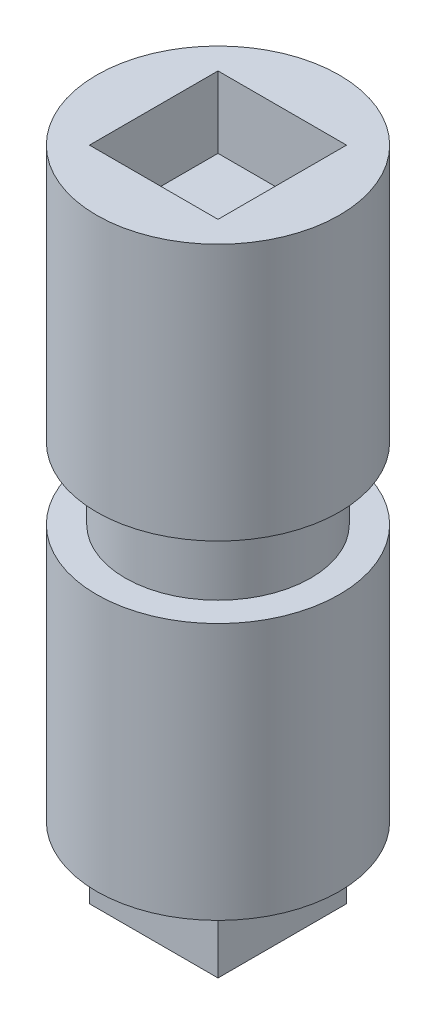
ISO-10303-21;
HEADER;
FILE_DESCRIPTION(('STEP AP214'),'2;1');
FILE_NAME('part.step','',(''),(''),'','','');
FILE_SCHEMA(('AUTOMOTIVE_DESIGN { 1 0 10303 214 1 1 1 1 }'));
ENDSEC;
DATA;
#1=APPLICATION_CONTEXT('core data for automotive mechanical design processes');
#2=APPLICATION_PROTOCOL_DEFINITION('international standard','automotive_design',2000,#1);
#3=PRODUCT_CONTEXT('',#1,'mechanical');
#4=PRODUCT('Part','Part','',(#3));
#5=PRODUCT_RELATED_PRODUCT_CATEGORY('part','',(#4));
#6=PRODUCT_DEFINITION_FORMATION('','',#4);
#7=PRODUCT_DEFINITION_CONTEXT('part definition',#1,'design');
#8=PRODUCT_DEFINITION('design','',#6,#7);
#9=PRODUCT_DEFINITION_SHAPE('','',#8);
#10=(LENGTH_UNIT() NAMED_UNIT(*) SI_UNIT(.MILLI.,.METRE.));
#11=(NAMED_UNIT(*) PLANE_ANGLE_UNIT() SI_UNIT($,.RADIAN.));
#12=(NAMED_UNIT(*) SI_UNIT($,.STERADIAN.) SOLID_ANGLE_UNIT());
#13=UNCERTAINTY_MEASURE_WITH_UNIT(LENGTH_MEASURE(1.E-05),#10,'distance_accuracy_value','');
#14=(GEOMETRIC_REPRESENTATION_CONTEXT(3) GLOBAL_UNCERTAINTY_ASSIGNED_CONTEXT((#13)) GLOBAL_UNIT_ASSIGNED_CONTEXT((#10,
#11,#12)) REPRESENTATION_CONTEXT('',''));
#15=CARTESIAN_POINT('',(0.,0.,0.));
#16=DIRECTION('',(0.,0.,1.));
#17=DIRECTION('',(1.,0.,0.));
#18=AXIS2_PLACEMENT_3D('',#15,#16,#17);
#19=CARTESIAN_POINT('',(0.,0.,0.));
#20=DIRECTION('',(0.,1.,0.));
#21=DIRECTION('',(0.,0.,1.));
#22=AXIS2_PLACEMENT_3D('',#19,#20,#21);
#23=PLANE('',#22);
#24=CARTESIAN_POINT('',(0.,0.,0.));
#25=DIRECTION('',(0.,1.,0.));
#26=DIRECTION('',(0.,0.,1.));
#27=AXIS2_PLACEMENT_3D('',#24,#25,#26);
#28=CIRCLE('',#27,85.);
#29=CARTESIAN_POINT('',(0.,0.,-85.));
#30=VERTEX_POINT('',#29);
#31=EDGE_CURVE('E37',#30,#30,#28,.T.);
#32=ORIENTED_EDGE('',*,*,#31,.F.);
#33=EDGE_LOOP('',(#32));
#34=FACE_BOUND('',#33,.T.);
#35=DIRECTION('',(0.,0.,-1.));
#36=VECTOR('',#35,1.);
#37=CARTESIAN_POINT('',(-45.,0.,45.));
#38=LINE('',#37,#36);
#39=CARTESIAN_POINT('',(-45.,0.,45.));
#40=VERTEX_POINT('',#39);
#41=CARTESIAN_POINT('',(-45.,0.,-45.));
#42=VERTEX_POINT('',#41);
#43=EDGE_CURVE('E58',#40,#42,#38,.T.);
#44=ORIENTED_EDGE('',*,*,#43,.F.);
#45=DIRECTION('',(-1.,0.,0.));
#46=VECTOR('',#45,1.);
#47=CARTESIAN_POINT('',(45.,0.,45.));
#48=LINE('',#47,#46);
#49=CARTESIAN_POINT('',(45.,0.,45.));
#50=VERTEX_POINT('',#49);
#51=EDGE_CURVE('E151',#50,#40,#48,.T.);
#52=ORIENTED_EDGE('',*,*,#51,.F.);
#53=DIRECTION('',(0.,0.,1.));
#54=VECTOR('',#53,1.);
#55=CARTESIAN_POINT('',(45.,0.,45.));
#56=LINE('',#55,#54);
#57=CARTESIAN_POINT('',(45.,0.,-45.));
#58=VERTEX_POINT('',#57);
#59=EDGE_CURVE('E162',#58,#50,#56,.T.);
#60=ORIENTED_EDGE('',*,*,#59,.F.);
#61=DIRECTION('',(1.,0.,0.));
#62=VECTOR('',#61,1.);
#63=CARTESIAN_POINT('',(45.,0.,-45.));
#64=LINE('',#63,#62);
#65=EDGE_CURVE('E159',#42,#58,#64,.T.);
#66=ORIENTED_EDGE('',*,*,#65,.F.);
#67=EDGE_LOOP('',(#44,#52,#60,#66));
#68=FACE_BOUND('',#67,.T.);
#69=ADVANCED_FACE('F33',(#34,#68),#23,.F.);
#70=CARTESIAN_POINT('',(0.,180.,0.));
#71=DIRECTION('',(0.,-1.,0.));
#72=DIRECTION('',(0.,0.,-1.));
#73=AXIS2_PLACEMENT_3D('',#70,#71,#72);
#74=CYLINDRICAL_SURFACE('',#73,85.);
#75=CARTESIAN_POINT('',(0.,180.,0.));
#76=DIRECTION('',(0.,1.,0.));
#77=DIRECTION('',(0.,0.,1.));
#78=AXIS2_PLACEMENT_3D('',#75,#76,#77);
#79=CIRCLE('',#78,85.);
#80=CARTESIAN_POINT('',(0.,180.,-85.));
#81=VERTEX_POINT('',#80);
#82=EDGE_CURVE('E42',#81,#81,#79,.T.);
#83=CARTESIAN_POINT('',(0.,180.,-85.));
#84=CARTESIAN_POINT('',(0.,178.125,-85.));
#85=CARTESIAN_POINT('',(0.,176.25,-85.));
#86=CARTESIAN_POINT('',(0.,172.5,-85.));
#87=CARTESIAN_POINT('',(0.,170.625,-85.));
#88=CARTESIAN_POINT('',(0.,166.875,-85.));
#89=CARTESIAN_POINT('',(0.,165.,-85.));
#90=CARTESIAN_POINT('',(0.,161.25,-85.));
#91=CARTESIAN_POINT('',(0.,159.375,-85.));
#92=CARTESIAN_POINT('',(0.,155.625,-85.));
#93=CARTESIAN_POINT('',(0.,153.75,-85.));
#94=CARTESIAN_POINT('',(0.,150.,-85.));
#95=CARTESIAN_POINT('',(0.,148.125,-85.));
#96=CARTESIAN_POINT('',(0.,144.375,-85.));
#97=CARTESIAN_POINT('',(0.,142.5,-85.));
#98=CARTESIAN_POINT('',(0.,138.75,-85.));
#99=CARTESIAN_POINT('',(0.,136.875,-85.));
#100=CARTESIAN_POINT('',(0.,133.125,-85.));
#101=CARTESIAN_POINT('',(0.,131.25,-85.));
#102=CARTESIAN_POINT('',(0.,127.5,-85.));
#103=CARTESIAN_POINT('',(0.,125.625,-85.));
#104=CARTESIAN_POINT('',(0.,121.875,-85.));
#105=CARTESIAN_POINT('',(0.,120.,-85.));
#106=CARTESIAN_POINT('',(0.,116.25,-85.));
#107=CARTESIAN_POINT('',(0.,114.375,-85.));
#108=CARTESIAN_POINT('',(0.,110.625,-85.));
#109=CARTESIAN_POINT('',(0.,108.75,-85.));
#110=CARTESIAN_POINT('',(0.,105.,-85.));
#111=CARTESIAN_POINT('',(0.,103.125,-85.));
#112=CARTESIAN_POINT('',(0.,99.375,-85.));
#113=CARTESIAN_POINT('',(0.,97.5,-85.));
#114=CARTESIAN_POINT('',(0.,93.75,-85.));
#115=CARTESIAN_POINT('',(0.,91.875,-85.));
#116=CARTESIAN_POINT('',(0.,88.125,-85.));
#117=CARTESIAN_POINT('',(0.,86.25,-85.));
#118=CARTESIAN_POINT('',(0.,82.5,-85.));
#119=CARTESIAN_POINT('',(0.,80.625,-85.));
#120=CARTESIAN_POINT('',(0.,76.875,-85.));
#121=CARTESIAN_POINT('',(0.,75.,-85.));
#122=CARTESIAN_POINT('',(0.,71.25,-85.));
#123=CARTESIAN_POINT('',(0.,69.375,-85.));
#124=CARTESIAN_POINT('',(0.,65.625,-85.));
#125=CARTESIAN_POINT('',(0.,63.75,-85.));
#126=CARTESIAN_POINT('',(0.,60.,-85.));
#127=CARTESIAN_POINT('',(0.,58.125,-85.));
#128=CARTESIAN_POINT('',(0.,54.375,-85.));
#129=CARTESIAN_POINT('',(0.,52.5,-85.));
#130=CARTESIAN_POINT('',(0.,48.75,-85.));
#131=CARTESIAN_POINT('',(0.,46.875,-85.));
#132=CARTESIAN_POINT('',(0.,43.125,-85.));
#133=CARTESIAN_POINT('',(0.,41.25,-85.));
#134=CARTESIAN_POINT('',(0.,37.5,-85.));
#135=CARTESIAN_POINT('',(0.,35.625,-85.));
#136=CARTESIAN_POINT('',(0.,31.875,-85.));
#137=CARTESIAN_POINT('',(0.,30.,-85.));
#138=CARTESIAN_POINT('',(0.,26.25,-85.));
#139=CARTESIAN_POINT('',(0.,24.375,-85.));
#140=CARTESIAN_POINT('',(0.,20.625,-85.));
#141=CARTESIAN_POINT('',(0.,18.75,-85.));
#142=CARTESIAN_POINT('',(0.,15.,-85.));
#143=CARTESIAN_POINT('',(0.,13.125,-85.));
#144=CARTESIAN_POINT('',(0.,9.37499999999998,-85.));
#145=CARTESIAN_POINT('',(0.,7.49999999999997,-85.));
#146=CARTESIAN_POINT('',(0.,3.74999999999997,-85.));
#147=CARTESIAN_POINT('',(0.,1.87499999999997,-85.));
#148=CARTESIAN_POINT('',(0.,0.,-85.));
#149=B_SPLINE_CURVE_WITH_KNOTS('',3,(#83,#84,#85,#86,#87,#88,#89,#90,#91,#92,#93,#94,#95,#96,
#97,#98,#99,#100,#101,#102,#103,#104,#105,#106,#107,#108,#109,#110,#111,#112,#113,#114,#115,
#116,#117,#118,#119,#120,#121,#122,#123,#124,#125,#126,#127,#128,#129,#130,#131,#132,#133,#134,
#135,#136,#137,#138,#139,#140,#141,#142,#143,#144,#145,#146,#147,#148),.UNSPECIFIED.,.F.,.F.,(4,
2,2,2,2,2,2,2,2,2,2,2,2,2,2,2,2,2,2,2,2,2,2,2,2,2,2,2,2,2,2,2,4),(0.,5.62499999999999,11.25,
16.875,22.5,28.125,33.75,39.375,45.,50.625,56.25,61.875,67.5,73.125,78.75,84.375,90.,95.625,
101.25,106.875,112.5,118.125,123.75,129.375,135.,140.625,146.25,151.875,157.5,163.125,168.75,
174.375,180.),.UNSPECIFIED.);
#150=EDGE_CURVE('BSEAM35',#81,#30,#149,.T.);
#151=ORIENTED_EDGE('',*,*,#82,.F.);
#152=ORIENTED_EDGE('',*,*,#31,.T.);
#153=ORIENTED_EDGE('',*,*,#150,.T.);
#154=ORIENTED_EDGE('',*,*,#150,.F.);
#155=EDGE_LOOP('',(#151,#153,#152,#154));
#156=FACE_BOUND('',#155,.T.);
#157=ADVANCED_FACE('F35',(#156),#74,.T.);
#158=CARTESIAN_POINT('',(0.,180.,0.));
#159=DIRECTION('',(0.,1.,0.));
#160=DIRECTION('',(0.,0.,1.));
#161=AXIS2_PLACEMENT_3D('',#158,#159,#160);
#162=PLANE('',#161);
#163=CARTESIAN_POINT('',(0.,180.,0.));
#164=DIRECTION('',(0.,1.,0.));
#165=DIRECTION('',(0.,0.,1.));
#166=AXIS2_PLACEMENT_3D('',#163,#164,#165);
#167=CIRCLE('',#166,65.);
#168=CARTESIAN_POINT('',(0.,180.,65.));
#169=VERTEX_POINT('',#168);
#170=EDGE_CURVE('E11',#169,#169,#167,.T.);
#171=ORIENTED_EDGE('',*,*,#170,.F.);
#172=EDGE_LOOP('',(#171));
#173=FACE_BOUND('',#172,.T.);
#174=ORIENTED_EDGE('',*,*,#82,.T.);
#175=EDGE_LOOP('',(#174));
#176=FACE_BOUND('',#175,.T.);
#177=ADVANCED_FACE('F187',(#173,#176),#162,.T.);
#178=CARTESIAN_POINT('',(-45.,-50.,45.));
#179=DIRECTION('',(1.,0.,0.));
#180=DIRECTION('',(0.,0.,-1.));
#181=AXIS2_PLACEMENT_3D('',#178,#179,#180);
#182=PLANE('',#181);
#183=ORIENTED_EDGE('',*,*,#43,.T.);
#184=DIRECTION('',(0.,1.,0.));
#185=VECTOR('',#184,1.);
#186=CARTESIAN_POINT('',(-45.,-50.,-45.));
#187=LINE('',#186,#185);
#188=CARTESIAN_POINT('',(-45.,-50.,-45.));
#189=VERTEX_POINT('',#188);
#190=EDGE_CURVE('E174',#189,#42,#187,.T.);
#191=ORIENTED_EDGE('',*,*,#190,.F.);
#192=DIRECTION('',(0.,0.,-1.));
#193=VECTOR('',#192,1.);
#194=CARTESIAN_POINT('',(-45.,-50.,45.));
#195=LINE('',#194,#193);
#196=CARTESIAN_POINT('',(-45.,-50.,45.));
#197=VERTEX_POINT('',#196);
#198=EDGE_CURVE('E147',#197,#189,#195,.T.);
#199=ORIENTED_EDGE('',*,*,#198,.F.);
#200=DIRECTION('',(0.,1.,0.));
#201=VECTOR('',#200,1.);
#202=CARTESIAN_POINT('',(-45.,-50.,45.));
#203=LINE('',#202,#201);
#204=EDGE_CURVE('E157',#197,#40,#203,.T.);
#205=ORIENTED_EDGE('',*,*,#204,.T.);
#206=EDGE_LOOP('',(#183,#191,#199,#205));
#207=FACE_BOUND('',#206,.T.);
#208=ADVANCED_FACE('F192',(#207),#182,.F.);
#209=CARTESIAN_POINT('',(45.,-50.,-45.));
#210=DIRECTION('',(0.,0.,1.));
#211=DIRECTION('',(1.,0.,0.));
#212=AXIS2_PLACEMENT_3D('',#209,#210,#211);
#213=PLANE('',#212);
#214=ORIENTED_EDGE('',*,*,#65,.T.);
#215=DIRECTION('',(0.,1.,0.));
#216=VECTOR('',#215,1.);
#217=CARTESIAN_POINT('',(45.,-50.,-45.));
#218=LINE('',#217,#216);
#219=CARTESIAN_POINT('',(45.,-50.,-45.));
#220=VERTEX_POINT('',#219);
#221=EDGE_CURVE('E171',#220,#58,#218,.T.);
#222=ORIENTED_EDGE('',*,*,#221,.F.);
#223=DIRECTION('',(1.,0.,0.));
#224=VECTOR('',#223,1.);
#225=CARTESIAN_POINT('',(45.,-50.,-45.));
#226=LINE('',#225,#224);
#227=EDGE_CURVE('E150',#189,#220,#226,.T.);
#228=ORIENTED_EDGE('',*,*,#227,.F.);
#229=ORIENTED_EDGE('',*,*,#190,.T.);
#230=EDGE_LOOP('',(#214,#222,#228,#229));
#231=FACE_BOUND('',#230,.T.);
#232=ADVANCED_FACE('F196',(#231),#213,.F.);
#233=CARTESIAN_POINT('',(45.,-50.,45.));
#234=DIRECTION('',(-1.,0.,0.));
#235=DIRECTION('',(0.,0.,1.));
#236=AXIS2_PLACEMENT_3D('',#233,#234,#235);
#237=PLANE('',#236);
#238=ORIENTED_EDGE('',*,*,#59,.T.);
#239=DIRECTION('',(0.,1.,0.));
#240=VECTOR('',#239,1.);
#241=CARTESIAN_POINT('',(45.,-50.,45.));
#242=LINE('',#241,#240);
#243=CARTESIAN_POINT('',(45.,-50.,45.));
#244=VERTEX_POINT('',#243);
#245=EDGE_CURVE('E168',#244,#50,#242,.T.);
#246=ORIENTED_EDGE('',*,*,#245,.F.);
#247=DIRECTION('',(0.,0.,1.));
#248=VECTOR('',#247,1.);
#249=CARTESIAN_POINT('',(45.,-50.,45.));
#250=LINE('',#249,#248);
#251=EDGE_CURVE('E153',#220,#244,#250,.T.);
#252=ORIENTED_EDGE('',*,*,#251,.F.);
#253=ORIENTED_EDGE('',*,*,#221,.T.);
#254=EDGE_LOOP('',(#238,#246,#252,#253));
#255=FACE_BOUND('',#254,.T.);
#256=ADVANCED_FACE('F200',(#255),#237,.F.);
#257=CARTESIAN_POINT('',(45.,-50.,45.));
#258=DIRECTION('',(0.,0.,-1.));
#259=DIRECTION('',(-1.,0.,0.));
#260=AXIS2_PLACEMENT_3D('',#257,#258,#259);
#261=PLANE('',#260);
#262=ORIENTED_EDGE('',*,*,#51,.T.);
#263=ORIENTED_EDGE('',*,*,#204,.F.);
#264=DIRECTION('',(-1.,0.,0.));
#265=VECTOR('',#264,1.);
#266=CARTESIAN_POINT('',(45.,-50.,45.));
#267=LINE('',#266,#265);
#268=EDGE_CURVE('E155',#244,#197,#267,.T.);
#269=ORIENTED_EDGE('',*,*,#268,.F.);
#270=ORIENTED_EDGE('',*,*,#245,.T.);
#271=EDGE_LOOP('',(#262,#263,#269,#270));
#272=FACE_BOUND('',#271,.T.);
#273=ADVANCED_FACE('F204',(#272),#261,.F.);
#274=CARTESIAN_POINT('',(0.,-50.,0.));
#275=DIRECTION('',(0.,1.,0.));
#276=DIRECTION('',(0.,0.,1.));
#277=AXIS2_PLACEMENT_3D('',#274,#275,#276);
#278=PLANE('',#277);
#279=ORIENTED_EDGE('',*,*,#198,.T.);
#280=ORIENTED_EDGE('',*,*,#227,.T.);
#281=ORIENTED_EDGE('',*,*,#251,.T.);
#282=ORIENTED_EDGE('',*,*,#268,.T.);
#283=EDGE_LOOP('',(#279,#280,#281,#282));
#284=FACE_BOUND('',#283,.T.);
#285=ADVANCED_FACE('F208',(#284),#278,.F.);
#286=CARTESIAN_POINT('',(0.,230.,0.));
#287=DIRECTION('',(0.,-1.,0.));
#288=DIRECTION('',(0.,0.,-1.));
#289=AXIS2_PLACEMENT_3D('',#286,#287,#288);
#290=CYLINDRICAL_SURFACE('',#289,65.);
#291=CARTESIAN_POINT('',(0.,230.,0.));
#292=DIRECTION('',(0.,1.,0.));
#293=DIRECTION('',(0.,0.,1.));
#294=AXIS2_PLACEMENT_3D('',#291,#292,#293);
#295=CIRCLE('',#294,65.);
#296=CARTESIAN_POINT('',(0.,230.,65.));
#297=VERTEX_POINT('',#296);
#298=EDGE_CURVE('E142',#297,#297,#295,.T.);
#299=ORIENTED_EDGE('',*,*,#298,.F.);
#300=EDGE_LOOP('',(#299));
#301=FACE_BOUND('',#300,.T.);
#302=ORIENTED_EDGE('',*,*,#170,.T.);
#303=EDGE_LOOP('',(#302));
#304=FACE_BOUND('',#303,.T.);
#305=ADVANCED_FACE('F212',(#301,#304),#290,.T.);
#306=CARTESIAN_POINT('',(0.,410.,0.));
#307=DIRECTION('',(0.,-1.,0.));
#308=DIRECTION('',(0.,0.,-1.));
#309=AXIS2_PLACEMENT_3D('',#306,#307,#308);
#310=CYLINDRICAL_SURFACE('',#309,85.);
#311=CARTESIAN_POINT('',(0.,410.,0.));
#312=DIRECTION('',(0.,1.,0.));
#313=DIRECTION('',(0.,0.,1.));
#314=AXIS2_PLACEMENT_3D('',#311,#312,#313);
#315=CIRCLE('',#314,85.);
#316=CARTESIAN_POINT('',(0.,410.,-85.));
#317=VERTEX_POINT('',#316);
#318=EDGE_CURVE('E139',#317,#317,#315,.T.);
#319=CARTESIAN_POINT('',(0.,230.,0.));
#320=DIRECTION('',(0.,1.,0.));
#321=DIRECTION('',(0.,0.,1.));
#322=AXIS2_PLACEMENT_3D('',#319,#320,#321);
#323=CIRCLE('',#322,85.);
#324=CARTESIAN_POINT('',(0.,230.,-85.));
#325=VERTEX_POINT('',#324);
#326=EDGE_CURVE('E135',#325,#325,#323,.T.);
#327=CARTESIAN_POINT('',(0.,410.,-85.));
#328=CARTESIAN_POINT('',(0.,408.125,-85.));
#329=CARTESIAN_POINT('',(0.,406.25,-85.));
#330=CARTESIAN_POINT('',(0.,402.5,-85.));
#331=CARTESIAN_POINT('',(0.,400.625,-85.));
#332=CARTESIAN_POINT('',(0.,396.875,-85.));
#333=CARTESIAN_POINT('',(0.,395.,-85.));
#334=CARTESIAN_POINT('',(0.,391.25,-85.));
#335=CARTESIAN_POINT('',(0.,389.375,-85.));
#336=CARTESIAN_POINT('',(0.,385.625,-85.));
#337=CARTESIAN_POINT('',(0.,383.75,-85.));
#338=CARTESIAN_POINT('',(0.,380.,-85.));
#339=CARTESIAN_POINT('',(0.,378.125,-85.));
#340=CARTESIAN_POINT('',(0.,374.375,-85.));
#341=CARTESIAN_POINT('',(0.,372.5,-85.));
#342=CARTESIAN_POINT('',(0.,368.75,-85.));
#343=CARTESIAN_POINT('',(0.,366.875,-85.));
#344=CARTESIAN_POINT('',(0.,363.125,-85.));
#345=CARTESIAN_POINT('',(0.,361.25,-85.));
#346=CARTESIAN_POINT('',(0.,357.5,-85.));
#347=CARTESIAN_POINT('',(0.,355.625,-85.));
#348=CARTESIAN_POINT('',(0.,351.875,-85.));
#349=CARTESIAN_POINT('',(0.,350.,-85.));
#350=CARTESIAN_POINT('',(0.,346.25,-85.));
#351=CARTESIAN_POINT('',(0.,344.375,-85.));
#352=CARTESIAN_POINT('',(0.,340.625,-85.));
#353=CARTESIAN_POINT('',(0.,338.75,-85.));
#354=CARTESIAN_POINT('',(0.,335.,-85.));
#355=CARTESIAN_POINT('',(0.,333.125,-85.));
#356=CARTESIAN_POINT('',(0.,329.375,-85.));
#357=CARTESIAN_POINT('',(0.,327.5,-85.));
#358=CARTESIAN_POINT('',(0.,323.75,-85.));
#359=CARTESIAN_POINT('',(0.,321.875,-85.));
#360=CARTESIAN_POINT('',(0.,318.125,-85.));
#361=CARTESIAN_POINT('',(0.,316.25,-85.));
#362=CARTESIAN_POINT('',(0.,312.5,-85.));
#363=CARTESIAN_POINT('',(0.,310.625,-85.));
#364=CARTESIAN_POINT('',(0.,306.875,-85.));
#365=CARTESIAN_POINT('',(0.,305.,-85.));
#366=CARTESIAN_POINT('',(0.,301.25,-85.));
#367=CARTESIAN_POINT('',(0.,299.375,-85.));
#368=CARTESIAN_POINT('',(0.,295.625,-85.));
#369=CARTESIAN_POINT('',(0.,293.75,-85.));
#370=CARTESIAN_POINT('',(0.,290.,-85.));
#371=CARTESIAN_POINT('',(0.,288.125,-85.));
#372=CARTESIAN_POINT('',(0.,284.375,-85.));
#373=CARTESIAN_POINT('',(0.,282.5,-85.));
#374=CARTESIAN_POINT('',(0.,278.75,-85.));
#375=CARTESIAN_POINT('',(0.,276.875,-85.));
#376=CARTESIAN_POINT('',(0.,273.125,-85.));
#377=CARTESIAN_POINT('',(0.,271.25,-85.));
#378=CARTESIAN_POINT('',(0.,267.5,-85.));
#379=CARTESIAN_POINT('',(0.,265.625,-85.));
#380=CARTESIAN_POINT('',(0.,261.875,-85.));
#381=CARTESIAN_POINT('',(0.,260.,-85.));
#382=CARTESIAN_POINT('',(0.,256.25,-85.));
#383=CARTESIAN_POINT('',(0.,254.375,-85.));
#384=CARTESIAN_POINT('',(0.,250.625,-85.));
#385=CARTESIAN_POINT('',(0.,248.75,-85.));
#386=CARTESIAN_POINT('',(0.,245.,-85.));
#387=CARTESIAN_POINT('',(0.,243.125,-85.));
#388=CARTESIAN_POINT('',(0.,239.375,-85.));
#389=CARTESIAN_POINT('',(0.,237.5,-85.));
#390=CARTESIAN_POINT('',(0.,233.75,-85.));
#391=CARTESIAN_POINT('',(0.,231.875,-85.));
#392=CARTESIAN_POINT('',(0.,230.,-85.));
#393=B_SPLINE_CURVE_WITH_KNOTS('',3,(#327,#328,#329,#330,#331,#332,#333,#334,#335,#336,#337,
#338,#339,#340,#341,#342,#343,#344,#345,#346,#347,#348,#349,#350,#351,#352,#353,#354,#355,#356,
#357,#358,#359,#360,#361,#362,#363,#364,#365,#366,#367,#368,#369,#370,#371,#372,#373,#374,#375,
#376,#377,#378,#379,#380,#381,#382,#383,#384,#385,#386,#387,#388,#389,#390,#391,#392),
.UNSPECIFIED.,.F.,.F.,(4,2,2,2,2,2,2,2,2,2,2,2,2,2,2,2,2,2,2,2,2,2,2,2,2,2,2,2,2,2,2,2,4),(0.,
5.62499999999999,11.25,16.875,22.5,28.125,33.7499999999999,39.375,45.,50.625,56.25,61.875,
67.4999999999999,73.125,78.75,84.375,90.,95.625,101.25,106.875,112.5,118.125,123.75,129.375,
135.,140.625,146.25,151.875,157.5,163.125,168.75,174.375,180.),.UNSPECIFIED.);
#394=EDGE_CURVE('BSEAM216',#317,#325,#393,.T.);
#395=ORIENTED_EDGE('',*,*,#318,.F.);
#396=ORIENTED_EDGE('',*,*,#326,.T.);
#397=ORIENTED_EDGE('',*,*,#394,.T.);
#398=ORIENTED_EDGE('',*,*,#394,.F.);
#399=EDGE_LOOP('',(#395,#397,#396,#398));
#400=FACE_BOUND('',#399,.T.);
#401=ADVANCED_FACE('F216',(#400),#310,.T.);
#402=CARTESIAN_POINT('',(0.,410.,0.));
#403=DIRECTION('',(0.,1.,0.));
#404=DIRECTION('',(0.,0.,1.));
#405=AXIS2_PLACEMENT_3D('',#402,#403,#404);
#406=PLANE('',#405);
#407=DIRECTION('',(0.,0.,-1.));
#408=VECTOR('',#407,1.);
#409=CARTESIAN_POINT('',(45.,410.,-45.));
#410=LINE('',#409,#408);
#411=CARTESIAN_POINT('',(45.,410.,45.));
#412=VERTEX_POINT('',#411);
#413=CARTESIAN_POINT('',(45.,410.,-45.));
#414=VERTEX_POINT('',#413);
#415=EDGE_CURVE('E50',#412,#414,#410,.T.);
#416=ORIENTED_EDGE('',*,*,#415,.F.);
#417=DIRECTION('',(1.,0.,0.));
#418=VECTOR('',#417,1.);
#419=CARTESIAN_POINT('',(-45.,410.,45.));
#420=LINE('',#419,#418);
#421=CARTESIAN_POINT('',(-45.,410.,45.));
#422=VERTEX_POINT('',#421);
#423=EDGE_CURVE('E120',#422,#412,#420,.T.);
#424=ORIENTED_EDGE('',*,*,#423,.F.);
#425=DIRECTION('',(0.,0.,1.));
#426=VECTOR('',#425,1.);
#427=CARTESIAN_POINT('',(-45.,410.,-45.));
#428=LINE('',#427,#426);
#429=CARTESIAN_POINT('',(-45.,410.,-45.));
#430=VERTEX_POINT('',#429);
#431=EDGE_CURVE('E123',#430,#422,#428,.T.);
#432=ORIENTED_EDGE('',*,*,#431,.F.);
#433=DIRECTION('',(-1.,0.,0.));
#434=VECTOR('',#433,1.);
#435=CARTESIAN_POINT('',(-45.,410.,-45.));
#436=LINE('',#435,#434);
#437=EDGE_CURVE('E129',#414,#430,#436,.T.);
#438=ORIENTED_EDGE('',*,*,#437,.F.);
#439=EDGE_LOOP('',(#416,#424,#432,#438));
#440=FACE_BOUND('',#439,.T.);
#441=ORIENTED_EDGE('',*,*,#318,.T.);
#442=EDGE_LOOP('',(#441));
#443=FACE_BOUND('',#442,.T.);
#444=ADVANCED_FACE('F220',(#440,#443),#406,.T.);
#445=CARTESIAN_POINT('',(0.,230.,0.));
#446=DIRECTION('',(0.,1.,0.));
#447=DIRECTION('',(0.,0.,1.));
#448=AXIS2_PLACEMENT_3D('',#445,#446,#447);
#449=PLANE('',#448);
#450=ORIENTED_EDGE('',*,*,#298,.T.);
#451=EDGE_LOOP('',(#450));
#452=FACE_BOUND('',#451,.T.);
#453=ORIENTED_EDGE('',*,*,#326,.F.);
#454=EDGE_LOOP('',(#453));
#455=FACE_BOUND('',#454,.T.);
#456=ADVANCED_FACE('F222',(#452,#455),#449,.F.);
#457=CARTESIAN_POINT('',(45.,360.,-45.));
#458=DIRECTION('',(1.,0.,0.));
#459=DIRECTION('',(0.,0.,-1.));
#460=AXIS2_PLACEMENT_3D('',#457,#458,#459);
#461=PLANE('',#460);
#462=ORIENTED_EDGE('',*,*,#415,.T.);
#463=DIRECTION('',(0.,1.,0.));
#464=VECTOR('',#463,1.);
#465=CARTESIAN_POINT('',(45.,360.,-45.));
#466=LINE('',#465,#464);
#467=CARTESIAN_POINT('',(45.,360.,-45.));
#468=VERTEX_POINT('',#467);
#469=EDGE_CURVE('E98',#468,#414,#466,.T.);
#470=ORIENTED_EDGE('',*,*,#469,.F.);
#471=DIRECTION('',(0.,0.,-1.));
#472=VECTOR('',#471,1.);
#473=CARTESIAN_POINT('',(45.,360.,-45.));
#474=LINE('',#473,#472);
#475=CARTESIAN_POINT('',(45.,360.,45.));
#476=VERTEX_POINT('',#475);
#477=EDGE_CURVE('E102',#476,#468,#474,.T.);
#478=ORIENTED_EDGE('',*,*,#477,.F.);
#479=DIRECTION('',(0.,1.,0.));
#480=VECTOR('',#479,1.);
#481=CARTESIAN_POINT('',(45.,360.,45.));
#482=LINE('',#481,#480);
#483=EDGE_CURVE('E133',#476,#412,#482,.T.);
#484=ORIENTED_EDGE('',*,*,#483,.T.);
#485=EDGE_LOOP('',(#462,#470,#478,#484));
#486=FACE_BOUND('',#485,.T.);
#487=ADVANCED_FACE('F100',(#486),#461,.F.);
#488=CARTESIAN_POINT('',(-45.,360.,45.));
#489=DIRECTION('',(0.,0.,1.));
#490=DIRECTION('',(1.,0.,0.));
#491=AXIS2_PLACEMENT_3D('',#488,#489,#490);
#492=PLANE('',#491);
#493=ORIENTED_EDGE('',*,*,#423,.T.);
#494=ORIENTED_EDGE('',*,*,#483,.F.);
#495=DIRECTION('',(1.,0.,0.));
#496=VECTOR('',#495,1.);
#497=CARTESIAN_POINT('',(-45.,360.,45.));
#498=LINE('',#497,#496);
#499=CARTESIAN_POINT('',(-45.,360.,45.));
#500=VERTEX_POINT('',#499);
#501=EDGE_CURVE('E108',#500,#476,#498,.T.);
#502=ORIENTED_EDGE('',*,*,#501,.F.);
#503=DIRECTION('',(0.,1.,0.));
#504=VECTOR('',#503,1.);
#505=CARTESIAN_POINT('',(-45.,360.,45.));
#506=LINE('',#505,#504);
#507=EDGE_CURVE('E136',#500,#422,#506,.T.);
#508=ORIENTED_EDGE('',*,*,#507,.T.);
#509=EDGE_LOOP('',(#493,#494,#502,#508));
#510=FACE_BOUND('',#509,.T.);
#511=ADVANCED_FACE('F231',(#510),#492,.F.);
#512=CARTESIAN_POINT('',(-45.,360.,-45.));
#513=DIRECTION('',(-1.,0.,0.));
#514=DIRECTION('',(0.,0.,1.));
#515=AXIS2_PLACEMENT_3D('',#512,#513,#514);
#516=PLANE('',#515);
#517=ORIENTED_EDGE('',*,*,#431,.T.);
#518=ORIENTED_EDGE('',*,*,#507,.F.);
#519=DIRECTION('',(0.,0.,1.));
#520=VECTOR('',#519,1.);
#521=CARTESIAN_POINT('',(-45.,360.,-45.));
#522=LINE('',#521,#520);
#523=CARTESIAN_POINT('',(-45.,360.,-45.));
#524=VERTEX_POINT('',#523);
#525=EDGE_CURVE('E116',#524,#500,#522,.T.);
#526=ORIENTED_EDGE('',*,*,#525,.F.);
#527=DIRECTION('',(0.,1.,0.));
#528=VECTOR('',#527,1.);
#529=CARTESIAN_POINT('',(-45.,360.,-45.));
#530=LINE('',#529,#528);
#531=EDGE_CURVE('E107',#524,#430,#530,.T.);
#532=ORIENTED_EDGE('',*,*,#531,.T.);
#533=EDGE_LOOP('',(#517,#518,#526,#532));
#534=FACE_BOUND('',#533,.T.);
#535=ADVANCED_FACE('F234',(#534),#516,.F.);
#536=CARTESIAN_POINT('',(-45.,360.,-45.));
#537=DIRECTION('',(0.,0.,-1.));
#538=DIRECTION('',(-1.,0.,0.));
#539=AXIS2_PLACEMENT_3D('',#536,#537,#538);
#540=PLANE('',#539);
#541=ORIENTED_EDGE('',*,*,#437,.T.);
#542=ORIENTED_EDGE('',*,*,#531,.F.);
#543=DIRECTION('',(-1.,0.,0.));
#544=VECTOR('',#543,1.);
#545=CARTESIAN_POINT('',(-45.,360.,-45.));
#546=LINE('',#545,#544);
#547=EDGE_CURVE('E111',#468,#524,#546,.T.);
#548=ORIENTED_EDGE('',*,*,#547,.F.);
#549=ORIENTED_EDGE('',*,*,#469,.T.);
#550=EDGE_LOOP('',(#541,#542,#548,#549));
#551=FACE_BOUND('',#550,.T.);
#552=ADVANCED_FACE('F112',(#551),#540,.F.);
#553=CARTESIAN_POINT('',(0.,360.,0.));
#554=DIRECTION('',(0.,1.,0.));
#555=DIRECTION('',(0.,0.,1.));
#556=AXIS2_PLACEMENT_3D('',#553,#554,#555);
#557=PLANE('',#556);
#558=ORIENTED_EDGE('',*,*,#477,.T.);
#559=ORIENTED_EDGE('',*,*,#547,.T.);
#560=ORIENTED_EDGE('',*,*,#525,.T.);
#561=ORIENTED_EDGE('',*,*,#501,.T.);
#562=EDGE_LOOP('',(#558,#559,#560,#561));
#563=FACE_BOUND('',#562,.T.);
#564=ADVANCED_FACE('F118',(#563),#557,.T.);
#565=CLOSED_SHELL('',(#69,#157,#177,#208,#232,#256,#273,#285,#305,#401,#444,#456,#487,#511,#535,
#552,#564));
#566=MANIFOLD_SOLID_BREP('B2',#565);
#567=ADVANCED_BREP_SHAPE_REPRESENTATION('',(#18,#566),#14);
#568=SHAPE_DEFINITION_REPRESENTATION(#9,#567);
ENDSEC;
END-ISO-10303-21;
